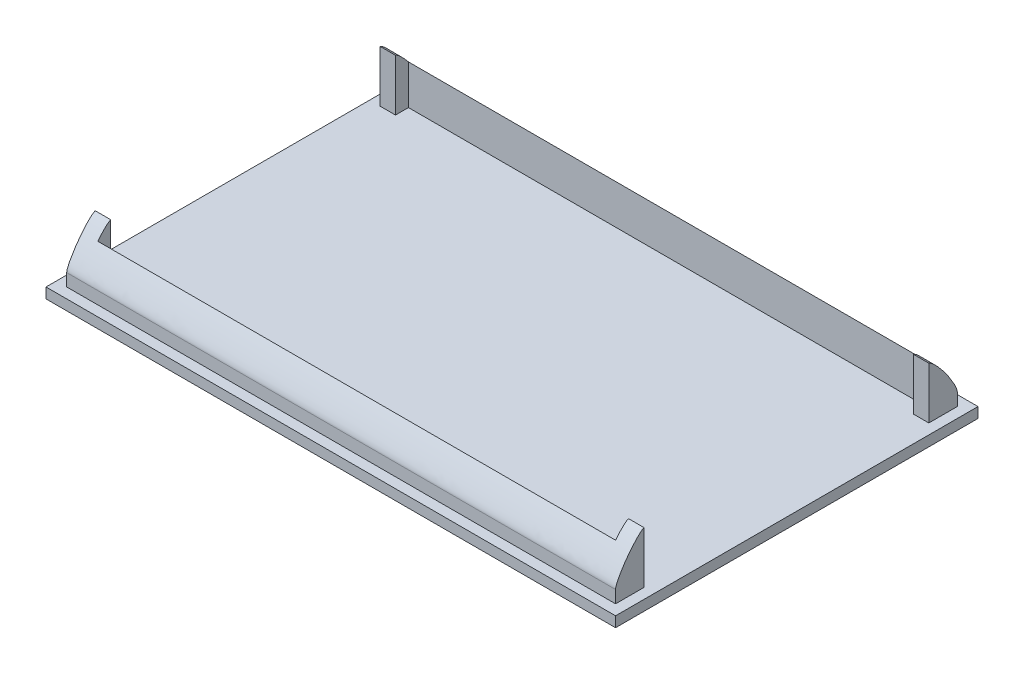
ISO-10303-21;
HEADER;
FILE_DESCRIPTION(('STEP AP214'),'2;1');
FILE_NAME('part.step','',(''),(''),'','','');
FILE_SCHEMA(('AUTOMOTIVE_DESIGN { 1 0 10303 214 1 1 1 1 }'));
ENDSEC;
DATA;
#1=APPLICATION_CONTEXT('core data for automotive mechanical design processes');
#2=APPLICATION_PROTOCOL_DEFINITION('international standard','automotive_design',2000,#1);
#3=PRODUCT_CONTEXT('',#1,'mechanical');
#4=PRODUCT('Part','Part','',(#3));
#5=PRODUCT_RELATED_PRODUCT_CATEGORY('part','',(#4));
#6=PRODUCT_DEFINITION_FORMATION('','',#4);
#7=PRODUCT_DEFINITION_CONTEXT('part definition',#1,'design');
#8=PRODUCT_DEFINITION('design','',#6,#7);
#9=PRODUCT_DEFINITION_SHAPE('','',#8);
#10=(LENGTH_UNIT() NAMED_UNIT(*) SI_UNIT(.MILLI.,.METRE.));
#11=(NAMED_UNIT(*) PLANE_ANGLE_UNIT() SI_UNIT($,.RADIAN.));
#12=(NAMED_UNIT(*) SI_UNIT($,.STERADIAN.) SOLID_ANGLE_UNIT());
#13=UNCERTAINTY_MEASURE_WITH_UNIT(LENGTH_MEASURE(1.E-05),#10,'distance_accuracy_value','');
#14=(GEOMETRIC_REPRESENTATION_CONTEXT(3) GLOBAL_UNCERTAINTY_ASSIGNED_CONTEXT((#13)) GLOBAL_UNIT_ASSIGNED_CONTEXT((#10,
#11,#12)) REPRESENTATION_CONTEXT('',''));
#15=CARTESIAN_POINT('',(0.,0.,0.));
#16=DIRECTION('',(0.,0.,1.));
#17=DIRECTION('',(1.,0.,0.));
#18=AXIS2_PLACEMENT_3D('',#15,#16,#17);
#19=CARTESIAN_POINT('',(53.,12.,-33.));
#20=DIRECTION('',(1.,0.,0.));
#21=DIRECTION('',(0.,0.,-1.));
#22=AXIS2_PLACEMENT_3D('',#19,#20,#21);
#23=PLANE('',#22);
#24=DIRECTION('',(0.,-1.,0.));
#25=VECTOR('',#24,1.);
#26=CARTESIAN_POINT('',(53.,12.,27.5));
#27=LINE('',#26,#25);
#28=CARTESIAN_POINT('',(53.,12.,27.5));
#29=VERTEX_POINT('',#28);
#30=CARTESIAN_POINT('',(53.,2.,27.5));
#31=VERTEX_POINT('',#30);
#32=EDGE_CURVE('E455',#29,#31,#27,.T.);
#33=ORIENTED_EDGE('',*,*,#32,.F.);
#34=CARTESIAN_POINT('',(53.,4.40065792321467,33.));
#35=CARTESIAN_POINT('',(53.,10.1906328388606,33.));
#36=CARTESIAN_POINT('',(53.,12.,27.5));
#37=(BOUNDED_CURVE() B_SPLINE_CURVE(2,(#34,#35,#36),.UNSPECIFIED.,.F.,
.F.) B_SPLINE_CURVE_WITH_KNOTS((3,3),(0.,1.),
.UNSPECIFIED.) CURVE() GEOMETRIC_REPRESENTATION_ITEM() RATIONAL_B_SPLINE_CURVE((1.,0.25,1.)) REPRESENTATION_ITEM(''));
#38=CARTESIAN_POINT('',(53.,4.40065792321467,33.));
#39=VERTEX_POINT('',#38);
#40=EDGE_CURVE('E92',#29,#39,#37,.F.);
#41=ORIENTED_EDGE('',*,*,#40,.T.);
#42=DIRECTION('',(0.,-1.,0.));
#43=VECTOR('',#42,1.);
#44=CARTESIAN_POINT('',(53.,12.,33.));
#45=LINE('',#44,#43);
#46=CARTESIAN_POINT('',(53.,2.,33.));
#47=VERTEX_POINT('',#46);
#48=EDGE_CURVE('E439',#39,#47,#45,.T.);
#49=ORIENTED_EDGE('',*,*,#48,.T.);
#50=DIRECTION('',(0.,0.,1.));
#51=VECTOR('',#50,1.);
#52=CARTESIAN_POINT('',(53.,2.,-33.));
#53=LINE('',#52,#51);
#54=EDGE_CURVE('E344',#31,#47,#53,.T.);
#55=ORIENTED_EDGE('',*,*,#54,.F.);
#56=EDGE_LOOP('',(#33,#41,#49,#55));
#57=FACE_BOUND('',#56,.T.);
#58=ADVANCED_FACE('F62',(#57),#23,.T.);
#59=CARTESIAN_POINT('',(-53.,12.,-33.));
#60=DIRECTION('',(1.,0.,0.));
#61=DIRECTION('',(0.,0.,-1.));
#62=AXIS2_PLACEMENT_3D('',#59,#60,#61);
#63=PLANE('',#62);
#64=DIRECTION('',(0.,-1.,0.));
#65=VECTOR('',#64,1.);
#66=CARTESIAN_POINT('',(-53.,12.,33.));
#67=LINE('',#66,#65);
#68=CARTESIAN_POINT('',(-53.,4.40065792321467,33.));
#69=VERTEX_POINT('',#68);
#70=CARTESIAN_POINT('',(-53.,2.,33.));
#71=VERTEX_POINT('',#70);
#72=EDGE_CURVE('E355',#69,#71,#67,.T.);
#73=ORIENTED_EDGE('',*,*,#72,.F.);
#74=CARTESIAN_POINT('',(-53.,12.,27.5));
#75=CARTESIAN_POINT('',(-53.,10.1906328388606,33.));
#76=CARTESIAN_POINT('',(-53.,4.40065792321467,33.));
#77=(BOUNDED_CURVE() B_SPLINE_CURVE(2,(#74,#75,#76),.UNSPECIFIED.,.F.,
.F.) B_SPLINE_CURVE_WITH_KNOTS((3,3),(0.,1.),
.UNSPECIFIED.) CURVE() GEOMETRIC_REPRESENTATION_ITEM() RATIONAL_B_SPLINE_CURVE((1.,0.25,1.)) REPRESENTATION_ITEM(''));
#78=CARTESIAN_POINT('',(-53.,12.,27.5));
#79=VERTEX_POINT('',#78);
#80=EDGE_CURVE('E13',#69,#79,#77,.F.);
#81=ORIENTED_EDGE('',*,*,#80,.T.);
#82=DIRECTION('',(0.,-1.,0.));
#83=VECTOR('',#82,1.);
#84=CARTESIAN_POINT('',(-53.,12.,27.5));
#85=LINE('',#84,#83);
#86=CARTESIAN_POINT('',(-53.,2.,27.5));
#87=VERTEX_POINT('',#86);
#88=EDGE_CURVE('E461',#79,#87,#85,.T.);
#89=ORIENTED_EDGE('',*,*,#88,.T.);
#90=DIRECTION('',(0.,0.,1.));
#91=VECTOR('',#90,1.);
#92=CARTESIAN_POINT('',(-53.,2.,-33.));
#93=LINE('',#92,#91);
#94=EDGE_CURVE('E351',#87,#71,#93,.T.);
#95=ORIENTED_EDGE('',*,*,#94,.T.);
#96=EDGE_LOOP('',(#73,#81,#89,#95));
#97=FACE_BOUND('',#96,.T.);
#98=ADVANCED_FACE('F407',(#97),#63,.F.);
#99=CARTESIAN_POINT('',(-50.,12.,30.));
#100=DIRECTION('',(-1.,0.,0.));
#101=DIRECTION('',(0.,0.,1.));
#102=AXIS2_PLACEMENT_3D('',#99,#100,#101);
#103=PLANE('',#102);
#104=DIRECTION('',(0.,1.,0.));
#105=VECTOR('',#104,1.);
#106=CARTESIAN_POINT('',(-50.,12.,27.5));
#107=LINE('',#106,#105);
#108=CARTESIAN_POINT('',(-50.,2.,27.5));
#109=VERTEX_POINT('',#108);
#110=CARTESIAN_POINT('',(-50.,12.,27.5));
#111=VERTEX_POINT('',#110);
#112=EDGE_CURVE('E467',#109,#111,#107,.T.);
#113=ORIENTED_EDGE('',*,*,#112,.T.);
#114=CARTESIAN_POINT('',(-50.,4.40065792321467,33.));
#115=CARTESIAN_POINT('',(-50.,10.1906328388606,33.));
#116=CARTESIAN_POINT('',(-50.,12.,27.5));
#117=(BOUNDED_CURVE() B_SPLINE_CURVE(2,(#114,#115,#116),.UNSPECIFIED.,.F.,
.F.) B_SPLINE_CURVE_WITH_KNOTS((3,3),(0.,1.),
.UNSPECIFIED.) CURVE() GEOMETRIC_REPRESENTATION_ITEM() RATIONAL_B_SPLINE_CURVE((1.,0.25,1.)) REPRESENTATION_ITEM(''));
#118=CARTESIAN_POINT('',(-50.,9.64556153314154,30.));
#119=VERTEX_POINT('',#118);
#120=EDGE_CURVE('E550',#111,#119,#117,.F.);
#121=ORIENTED_EDGE('',*,*,#120,.T.);
#122=DIRECTION('',(0.,-1.,0.));
#123=VECTOR('',#122,1.);
#124=CARTESIAN_POINT('',(-50.,12.,30.));
#125=LINE('',#124,#123);
#126=CARTESIAN_POINT('',(-50.,2.,30.));
#127=VERTEX_POINT('',#126);
#128=EDGE_CURVE('E328',#119,#127,#125,.T.);
#129=ORIENTED_EDGE('',*,*,#128,.T.);
#130=DIRECTION('',(0.,0.,-1.));
#131=VECTOR('',#130,1.);
#132=CARTESIAN_POINT('',(-50.,2.,30.));
#133=LINE('',#132,#131);
#134=EDGE_CURVE('E327',#127,#109,#133,.T.);
#135=ORIENTED_EDGE('',*,*,#134,.T.);
#136=EDGE_LOOP('',(#113,#121,#129,#135));
#137=FACE_BOUND('',#136,.T.);
#138=ADVANCED_FACE('F411',(#137),#103,.F.);
#139=CARTESIAN_POINT('',(50.,12.,30.));
#140=DIRECTION('',(-1.,0.,0.));
#141=DIRECTION('',(0.,0.,1.));
#142=AXIS2_PLACEMENT_3D('',#139,#140,#141);
#143=PLANE('',#142);
#144=DIRECTION('',(0.,-1.,0.));
#145=VECTOR('',#144,1.);
#146=CARTESIAN_POINT('',(50.,12.,30.));
#147=LINE('',#146,#145);
#148=CARTESIAN_POINT('',(50.,9.64556153314154,30.));
#149=VERTEX_POINT('',#148);
#150=CARTESIAN_POINT('',(50.,2.,30.));
#151=VERTEX_POINT('',#150);
#152=EDGE_CURVE('E326',#149,#151,#147,.T.);
#153=ORIENTED_EDGE('',*,*,#152,.F.);
#154=CARTESIAN_POINT('',(50.,12.,27.5));
#155=CARTESIAN_POINT('',(50.,10.1906328388606,33.));
#156=CARTESIAN_POINT('',(50.,4.40065792321467,33.));
#157=(BOUNDED_CURVE() B_SPLINE_CURVE(2,(#154,#155,#156),.UNSPECIFIED.,.F.,
.F.) B_SPLINE_CURVE_WITH_KNOTS((3,3),(0.,1.),
.UNSPECIFIED.) CURVE() GEOMETRIC_REPRESENTATION_ITEM() RATIONAL_B_SPLINE_CURVE((1.,0.25,1.)) REPRESENTATION_ITEM(''));
#158=CARTESIAN_POINT('',(50.,12.,27.5));
#159=VERTEX_POINT('',#158);
#160=EDGE_CURVE('E563',#149,#159,#157,.F.);
#161=ORIENTED_EDGE('',*,*,#160,.T.);
#162=DIRECTION('',(0.,1.,0.));
#163=VECTOR('',#162,1.);
#164=CARTESIAN_POINT('',(50.,12.,27.5));
#165=LINE('',#164,#163);
#166=CARTESIAN_POINT('',(50.,2.,27.5));
#167=VERTEX_POINT('',#166);
#168=EDGE_CURVE('E231',#167,#159,#165,.T.);
#169=ORIENTED_EDGE('',*,*,#168,.F.);
#170=DIRECTION('',(0.,0.,-1.));
#171=VECTOR('',#170,1.);
#172=CARTESIAN_POINT('',(50.,2.,30.));
#173=LINE('',#172,#171);
#174=EDGE_CURVE('E668',#151,#167,#173,.T.);
#175=ORIENTED_EDGE('',*,*,#174,.F.);
#176=EDGE_LOOP('',(#153,#161,#169,#175));
#177=FACE_BOUND('',#176,.T.);
#178=ADVANCED_FACE('F404',(#177),#143,.T.);
#179=CARTESIAN_POINT('',(55.,2.,35.));
#180=DIRECTION('',(-1.,0.,0.));
#181=DIRECTION('',(0.,0.,1.));
#182=AXIS2_PLACEMENT_3D('',#179,#180,#181);
#183=PLANE('',#182);
#184=DIRECTION('',(0.,0.,-1.));
#185=VECTOR('',#184,1.);
#186=CARTESIAN_POINT('',(55.,0.,35.));
#187=LINE('',#186,#185);
#188=CARTESIAN_POINT('',(55.,0.,35.));
#189=VERTEX_POINT('',#188);
#190=CARTESIAN_POINT('',(55.,0.,-35.));
#191=VERTEX_POINT('',#190);
#192=EDGE_CURVE('E449',#189,#191,#187,.T.);
#193=ORIENTED_EDGE('',*,*,#192,.T.);
#194=DIRECTION('',(0.,-1.,0.));
#195=VECTOR('',#194,1.);
#196=CARTESIAN_POINT('',(55.,2.,-35.));
#197=LINE('',#196,#195);
#198=CARTESIAN_POINT('',(55.,2.,-35.));
#199=VERTEX_POINT('',#198);
#200=EDGE_CURVE('E677',#199,#191,#197,.T.);
#201=ORIENTED_EDGE('',*,*,#200,.F.);
#202=DIRECTION('',(0.,0.,-1.));
#203=VECTOR('',#202,1.);
#204=CARTESIAN_POINT('',(55.,2.,35.));
#205=LINE('',#204,#203);
#206=CARTESIAN_POINT('',(55.,2.,35.));
#207=VERTEX_POINT('',#206);
#208=EDGE_CURVE('E445',#207,#199,#205,.T.);
#209=ORIENTED_EDGE('',*,*,#208,.F.);
#210=DIRECTION('',(0.,-1.,0.));
#211=VECTOR('',#210,1.);
#212=CARTESIAN_POINT('',(55.,2.,35.));
#213=LINE('',#212,#211);
#214=EDGE_CURVE('E689',#207,#189,#213,.T.);
#215=ORIENTED_EDGE('',*,*,#214,.T.);
#216=EDGE_LOOP('',(#193,#201,#209,#215));
#217=FACE_BOUND('',#216,.T.);
#218=ADVANCED_FACE('F262',(#217),#183,.F.);
#219=CARTESIAN_POINT('',(-55.,2.,-35.));
#220=DIRECTION('',(0.,0.,1.));
#221=DIRECTION('',(1.,0.,0.));
#222=AXIS2_PLACEMENT_3D('',#219,#220,#221);
#223=PLANE('',#222);
#224=DIRECTION('',(-1.,0.,0.));
#225=VECTOR('',#224,1.);
#226=CARTESIAN_POINT('',(-55.,0.,-35.));
#227=LINE('',#226,#225);
#228=CARTESIAN_POINT('',(-55.,0.,-35.));
#229=VERTEX_POINT('',#228);
#230=EDGE_CURVE('E697',#191,#229,#227,.T.);
#231=ORIENTED_EDGE('',*,*,#230,.T.);
#232=DIRECTION('',(0.,-1.,0.));
#233=VECTOR('',#232,1.);
#234=CARTESIAN_POINT('',(-55.,2.,-35.));
#235=LINE('',#234,#233);
#236=CARTESIAN_POINT('',(-55.,2.,-35.));
#237=VERTEX_POINT('',#236);
#238=EDGE_CURVE('E679',#237,#229,#235,.T.);
#239=ORIENTED_EDGE('',*,*,#238,.F.);
#240=DIRECTION('',(-1.,0.,0.));
#241=VECTOR('',#240,1.);
#242=CARTESIAN_POINT('',(-55.,2.,-35.));
#243=LINE('',#242,#241);
#244=EDGE_CURVE('E702',#199,#237,#243,.T.);
#245=ORIENTED_EDGE('',*,*,#244,.F.);
#246=ORIENTED_EDGE('',*,*,#200,.T.);
#247=EDGE_LOOP('',(#231,#239,#245,#246));
#248=FACE_BOUND('',#247,.T.);
#249=ADVANCED_FACE('F397',(#248),#223,.F.);
#250=CARTESIAN_POINT('',(-55.,2.,35.));
#251=DIRECTION('',(1.,0.,0.));
#252=DIRECTION('',(0.,0.,-1.));
#253=AXIS2_PLACEMENT_3D('',#250,#251,#252);
#254=PLANE('',#253);
#255=DIRECTION('',(0.,0.,1.));
#256=VECTOR('',#255,1.);
#257=CARTESIAN_POINT('',(-55.,0.,35.));
#258=LINE('',#257,#256);
#259=CARTESIAN_POINT('',(-55.,0.,35.));
#260=VERTEX_POINT('',#259);
#261=EDGE_CURVE('E695',#229,#260,#258,.T.);
#262=ORIENTED_EDGE('',*,*,#261,.T.);
#263=DIRECTION('',(0.,-1.,0.));
#264=VECTOR('',#263,1.);
#265=CARTESIAN_POINT('',(-55.,2.,35.));
#266=LINE('',#265,#264);
#267=CARTESIAN_POINT('',(-55.,2.,35.));
#268=VERTEX_POINT('',#267);
#269=EDGE_CURVE('E684',#268,#260,#266,.T.);
#270=ORIENTED_EDGE('',*,*,#269,.F.);
#271=DIRECTION('',(0.,0.,1.));
#272=VECTOR('',#271,1.);
#273=CARTESIAN_POINT('',(-55.,2.,35.));
#274=LINE('',#273,#272);
#275=EDGE_CURVE('E701',#237,#268,#274,.T.);
#276=ORIENTED_EDGE('',*,*,#275,.F.);
#277=ORIENTED_EDGE('',*,*,#238,.T.);
#278=EDGE_LOOP('',(#262,#270,#276,#277));
#279=FACE_BOUND('',#278,.T.);
#280=ADVANCED_FACE('F394',(#279),#254,.F.);
#281=CARTESIAN_POINT('',(-55.,2.,35.));
#282=DIRECTION('',(0.,0.,-1.));
#283=DIRECTION('',(-1.,0.,0.));
#284=AXIS2_PLACEMENT_3D('',#281,#282,#283);
#285=PLANE('',#284);
#286=DIRECTION('',(1.,0.,0.));
#287=VECTOR('',#286,1.);
#288=CARTESIAN_POINT('',(-55.,0.,35.));
#289=LINE('',#288,#287);
#290=EDGE_CURVE('E693',#260,#189,#289,.T.);
#291=ORIENTED_EDGE('',*,*,#290,.T.);
#292=ORIENTED_EDGE('',*,*,#214,.F.);
#293=DIRECTION('',(1.,0.,0.));
#294=VECTOR('',#293,1.);
#295=CARTESIAN_POINT('',(-55.,2.,35.));
#296=LINE('',#295,#294);
#297=EDGE_CURVE('E692',#268,#207,#296,.T.);
#298=ORIENTED_EDGE('',*,*,#297,.F.);
#299=ORIENTED_EDGE('',*,*,#269,.T.);
#300=EDGE_LOOP('',(#291,#292,#298,#299));
#301=FACE_BOUND('',#300,.T.);
#302=ADVANCED_FACE('F390',(#301),#285,.F.);
#303=CARTESIAN_POINT('',(0.,0.,0.));
#304=DIRECTION('',(0.,-1.,0.));
#305=DIRECTION('',(0.,0.,-1.));
#306=AXIS2_PLACEMENT_3D('',#303,#304,#305);
#307=PLANE('',#306);
#308=ORIENTED_EDGE('',*,*,#192,.F.);
#309=ORIENTED_EDGE('',*,*,#290,.F.);
#310=ORIENTED_EDGE('',*,*,#261,.F.);
#311=ORIENTED_EDGE('',*,*,#230,.F.);
#312=EDGE_LOOP('',(#308,#309,#310,#311));
#313=FACE_BOUND('',#312,.T.);
#314=ADVANCED_FACE('F381',(#313),#307,.T.);
#315=CARTESIAN_POINT('',(-53.,12.,33.));
#316=DIRECTION('',(0.,0.,-1.));
#317=DIRECTION('',(-1.,0.,0.));
#318=AXIS2_PLACEMENT_3D('',#315,#316,#317);
#319=PLANE('',#318);
#320=ORIENTED_EDGE('',*,*,#48,.F.);
#321=CARTESIAN_POINT('',(-58.3,4.40065792321467,33.));
#322=CARTESIAN_POINT('',(-19.4333333333333,4.40065792321467,33.));
#323=CARTESIAN_POINT('',(19.4333333333334,4.40065792321467,33.));
#324=CARTESIAN_POINT('',(58.3,4.40065792321467,33.));
#325=(BOUNDED_CURVE() B_SPLINE_CURVE(3,(#321,#322,#323,#324),.UNSPECIFIED.,.F.,
.F.) B_SPLINE_CURVE_WITH_KNOTS((4,4),(-0.0583,0.0583),
.UNSPECIFIED.) CURVE() GEOMETRIC_REPRESENTATION_ITEM() RATIONAL_B_SPLINE_CURVE((1.,1.,1.,1.)) REPRESENTATION_ITEM(''));
#326=EDGE_CURVE('E77',#39,#69,#325,.F.);
#327=ORIENTED_EDGE('',*,*,#326,.T.);
#328=ORIENTED_EDGE('',*,*,#72,.T.);
#329=DIRECTION('',(1.,0.,0.));
#330=VECTOR('',#329,1.);
#331=CARTESIAN_POINT('',(-53.,2.,33.));
#332=LINE('',#331,#330);
#333=EDGE_CURVE('E341',#71,#47,#332,.T.);
#334=ORIENTED_EDGE('',*,*,#333,.T.);
#335=EDGE_LOOP('',(#320,#327,#328,#334));
#336=FACE_BOUND('',#335,.T.);
#337=ADVANCED_FACE('F371',(#336),#319,.F.);
#338=DIRECTION('',(0.,-1.,0.));
#339=VECTOR('',#338,1.);
#340=CARTESIAN_POINT('',(53.,12.,-33.));
#341=LINE('',#340,#339);
#342=CARTESIAN_POINT('',(53.,4.40065792321467,-33.));
#343=VERTEX_POINT('',#342);
#344=CARTESIAN_POINT('',(53.,2.,-33.));
#345=VERTEX_POINT('',#344);
#346=EDGE_CURVE('E214',#343,#345,#341,.T.);
#347=ORIENTED_EDGE('',*,*,#346,.F.);
#348=CARTESIAN_POINT('',(53.,12.,-27.5));
#349=CARTESIAN_POINT('',(53.,10.1906328388606,-33.));
#350=CARTESIAN_POINT('',(53.,4.40065792321467,-33.));
#351=(BOUNDED_CURVE() B_SPLINE_CURVE(2,(#348,#349,#350),.UNSPECIFIED.,.F.,
.F.) B_SPLINE_CURVE_WITH_KNOTS((3,3),(0.,1.),
.UNSPECIFIED.) CURVE() GEOMETRIC_REPRESENTATION_ITEM() RATIONAL_B_SPLINE_CURVE((1.,0.25,1.)) REPRESENTATION_ITEM(''));
#352=CARTESIAN_POINT('',(53.,12.,-27.5));
#353=VERTEX_POINT('',#352);
#354=EDGE_CURVE('E207',#343,#353,#351,.F.);
#355=ORIENTED_EDGE('',*,*,#354,.T.);
#356=DIRECTION('',(0.,1.,0.));
#357=VECTOR('',#356,1.);
#358=CARTESIAN_POINT('',(53.,12.,-27.5));
#359=LINE('',#358,#357);
#360=CARTESIAN_POINT('',(53.,2.,-27.5));
#361=VERTEX_POINT('',#360);
#362=EDGE_CURVE('E212',#361,#353,#359,.T.);
#363=ORIENTED_EDGE('',*,*,#362,.F.);
#364=EDGE_CURVE('E346',#345,#361,#53,.T.);
#365=ORIENTED_EDGE('',*,*,#364,.F.);
#366=EDGE_LOOP('',(#347,#355,#363,#365));
#367=FACE_BOUND('',#366,.T.);
#368=ADVANCED_FACE('F210',(#367),#23,.T.);
#369=CARTESIAN_POINT('',(-53.,12.,-33.));
#370=DIRECTION('',(0.,0.,-1.));
#371=DIRECTION('',(-1.,0.,0.));
#372=AXIS2_PLACEMENT_3D('',#369,#370,#371);
#373=PLANE('',#372);
#374=DIRECTION('',(0.,-1.,0.));
#375=VECTOR('',#374,1.);
#376=CARTESIAN_POINT('',(-53.,12.,-33.));
#377=LINE('',#376,#375);
#378=CARTESIAN_POINT('',(-53.,4.40065792321467,-33.));
#379=VERTEX_POINT('',#378);
#380=CARTESIAN_POINT('',(-53.,2.,-33.));
#381=VERTEX_POINT('',#380);
#382=EDGE_CURVE('E362',#379,#381,#377,.T.);
#383=ORIENTED_EDGE('',*,*,#382,.F.);
#384=CARTESIAN_POINT('',(58.3,4.40065792321467,-33.));
#385=CARTESIAN_POINT('',(19.4333333333334,4.40065792321467,-33.));
#386=CARTESIAN_POINT('',(-19.4333333333333,4.40065792321467,-33.));
#387=CARTESIAN_POINT('',(-58.3,4.40065792321467,-33.));
#388=(BOUNDED_CURVE() B_SPLINE_CURVE(3,(#384,#385,#386,#387),.UNSPECIFIED.,.F.,
.F.) B_SPLINE_CURVE_WITH_KNOTS((4,4),(-0.0583,0.0583),
.UNSPECIFIED.) CURVE() GEOMETRIC_REPRESENTATION_ITEM() RATIONAL_B_SPLINE_CURVE((1.,1.,1.,1.)) REPRESENTATION_ITEM(''));
#389=EDGE_CURVE('E221',#379,#343,#388,.F.);
#390=ORIENTED_EDGE('',*,*,#389,.T.);
#391=ORIENTED_EDGE('',*,*,#346,.T.);
#392=DIRECTION('',(1.,0.,0.));
#393=VECTOR('',#392,1.);
#394=CARTESIAN_POINT('',(-53.,2.,-33.));
#395=LINE('',#394,#393);
#396=EDGE_CURVE('E348',#381,#345,#395,.T.);
#397=ORIENTED_EDGE('',*,*,#396,.F.);
#398=EDGE_LOOP('',(#383,#390,#391,#397));
#399=FACE_BOUND('',#398,.T.);
#400=ADVANCED_FACE('F416',(#399),#373,.T.);
#401=DIRECTION('',(0.,1.,0.));
#402=VECTOR('',#401,1.);
#403=CARTESIAN_POINT('',(-53.,12.,-27.5));
#404=LINE('',#403,#402);
#405=CARTESIAN_POINT('',(-53.,2.,-27.5));
#406=VERTEX_POINT('',#405);
#407=CARTESIAN_POINT('',(-53.,12.,-27.5));
#408=VERTEX_POINT('',#407);
#409=EDGE_CURVE('E232',#406,#408,#404,.T.);
#410=ORIENTED_EDGE('',*,*,#409,.T.);
#411=CARTESIAN_POINT('',(-53.,4.40065792321467,-33.));
#412=CARTESIAN_POINT('',(-53.,10.1906328388606,-33.));
#413=CARTESIAN_POINT('',(-53.,12.,-27.5));
#414=(BOUNDED_CURVE() B_SPLINE_CURVE(2,(#411,#412,#413),.UNSPECIFIED.,.F.,
.F.) B_SPLINE_CURVE_WITH_KNOTS((3,3),(0.,1.),
.UNSPECIFIED.) CURVE() GEOMETRIC_REPRESENTATION_ITEM() RATIONAL_B_SPLINE_CURVE((1.,0.25,1.)) REPRESENTATION_ITEM(''));
#415=EDGE_CURVE('E312',#408,#379,#414,.F.);
#416=ORIENTED_EDGE('',*,*,#415,.T.);
#417=ORIENTED_EDGE('',*,*,#382,.T.);
#418=EDGE_CURVE('E352',#381,#406,#93,.T.);
#419=ORIENTED_EDGE('',*,*,#418,.T.);
#420=EDGE_LOOP('',(#410,#416,#417,#419));
#421=FACE_BOUND('',#420,.T.);
#422=ADVANCED_FACE('F414',(#421),#63,.F.);
#423=CARTESIAN_POINT('',(-50.,12.,-30.));
#424=DIRECTION('',(0.,0.,-1.));
#425=DIRECTION('',(-1.,0.,0.));
#426=AXIS2_PLACEMENT_3D('',#423,#424,#425);
#427=PLANE('',#426);
#428=DIRECTION('',(0.,-1.,0.));
#429=VECTOR('',#428,1.);
#430=CARTESIAN_POINT('',(50.,12.,-30.));
#431=LINE('',#430,#429);
#432=CARTESIAN_POINT('',(50.,9.64556153314155,-30.));
#433=VERTEX_POINT('',#432);
#434=CARTESIAN_POINT('',(50.,2.,-30.));
#435=VERTEX_POINT('',#434);
#436=EDGE_CURVE('E317',#433,#435,#431,.T.);
#437=ORIENTED_EDGE('',*,*,#436,.F.);
#438=CARTESIAN_POINT('',(-58.3,9.64556153314155,-30.));
#439=CARTESIAN_POINT('',(-19.4333333333333,9.64556153314155,-30.));
#440=CARTESIAN_POINT('',(19.4333333333333,9.64556153314155,-30.));
#441=CARTESIAN_POINT('',(58.3,9.64556153314155,-30.));
#442=(BOUNDED_CURVE() B_SPLINE_CURVE(3,(#438,#439,#440,#441),.UNSPECIFIED.,.F.,
.F.) B_SPLINE_CURVE_WITH_KNOTS((4,4),(-0.0583,0.0583),
.UNSPECIFIED.) CURVE() GEOMETRIC_REPRESENTATION_ITEM() RATIONAL_B_SPLINE_CURVE((0.637003073573872,
0.637003073573872,0.637003073573872,0.637003073573872)) REPRESENTATION_ITEM(''));
#443=CARTESIAN_POINT('',(-50.,9.64556153314153,-30.));
#444=VERTEX_POINT('',#443);
#445=EDGE_CURVE('E305',#433,#444,#442,.F.);
#446=ORIENTED_EDGE('',*,*,#445,.T.);
#447=DIRECTION('',(0.,-1.,0.));
#448=VECTOR('',#447,1.);
#449=CARTESIAN_POINT('',(-50.,12.,-30.));
#450=LINE('',#449,#448);
#451=CARTESIAN_POINT('',(-50.,2.,-30.));
#452=VERTEX_POINT('',#451);
#453=EDGE_CURVE('E345',#444,#452,#450,.T.);
#454=ORIENTED_EDGE('',*,*,#453,.T.);
#455=DIRECTION('',(1.,0.,0.));
#456=VECTOR('',#455,1.);
#457=CARTESIAN_POINT('',(-50.,2.,-30.));
#458=LINE('',#457,#456);
#459=EDGE_CURVE('E325',#452,#435,#458,.T.);
#460=ORIENTED_EDGE('',*,*,#459,.T.);
#461=EDGE_LOOP('',(#437,#446,#454,#460));
#462=FACE_BOUND('',#461,.T.);
#463=ADVANCED_FACE('F323',(#462),#427,.F.);
#464=ORIENTED_EDGE('',*,*,#453,.F.);
#465=CARTESIAN_POINT('',(-50.,12.,-27.5));
#466=CARTESIAN_POINT('',(-50.,10.1906328388606,-33.));
#467=CARTESIAN_POINT('',(-50.,4.40065792321467,-33.));
#468=(BOUNDED_CURVE() B_SPLINE_CURVE(2,(#465,#466,#467),.UNSPECIFIED.,.F.,
.F.) B_SPLINE_CURVE_WITH_KNOTS((3,3),(0.,1.),
.UNSPECIFIED.) CURVE() GEOMETRIC_REPRESENTATION_ITEM() RATIONAL_B_SPLINE_CURVE((1.,0.25,1.)) REPRESENTATION_ITEM(''));
#469=CARTESIAN_POINT('',(-50.,12.,-27.5));
#470=VERTEX_POINT('',#469);
#471=EDGE_CURVE('E307',#444,#470,#468,.F.);
#472=ORIENTED_EDGE('',*,*,#471,.T.);
#473=DIRECTION('',(0.,-1.,0.));
#474=VECTOR('',#473,1.);
#475=CARTESIAN_POINT('',(-50.,12.,-27.5));
#476=LINE('',#475,#474);
#477=CARTESIAN_POINT('',(-50.,2.,-27.5));
#478=VERTEX_POINT('',#477);
#479=EDGE_CURVE('E537',#470,#478,#476,.T.);
#480=ORIENTED_EDGE('',*,*,#479,.T.);
#481=EDGE_CURVE('E331',#478,#452,#133,.T.);
#482=ORIENTED_EDGE('',*,*,#481,.T.);
#483=EDGE_LOOP('',(#464,#472,#480,#482));
#484=FACE_BOUND('',#483,.T.);
#485=ADVANCED_FACE('F514',(#484),#103,.F.);
#486=CARTESIAN_POINT('',(-50.,12.,30.));
#487=DIRECTION('',(0.,0.,-1.));
#488=DIRECTION('',(-1.,0.,0.));
#489=AXIS2_PLACEMENT_3D('',#486,#487,#488);
#490=PLANE('',#489);
#491=ORIENTED_EDGE('',*,*,#128,.F.);
#492=CARTESIAN_POINT('',(58.3,9.64556153314154,30.));
#493=CARTESIAN_POINT('',(19.4333333333334,9.64556153314154,30.));
#494=CARTESIAN_POINT('',(-19.4333333333333,9.64556153314154,30.));
#495=CARTESIAN_POINT('',(-58.3,9.64556153314154,30.));
#496=(BOUNDED_CURVE() B_SPLINE_CURVE(3,(#492,#493,#494,#495),.UNSPECIFIED.,.F.,
.F.) B_SPLINE_CURVE_WITH_KNOTS((4,4),(-0.0583,0.0583),
.UNSPECIFIED.) CURVE() GEOMETRIC_REPRESENTATION_ITEM() RATIONAL_B_SPLINE_CURVE((0.637003073573871,
0.637003073573871,0.637003073573871,0.637003073573871)) REPRESENTATION_ITEM(''));
#497=EDGE_CURVE('E498',#119,#149,#496,.F.);
#498=ORIENTED_EDGE('',*,*,#497,.T.);
#499=ORIENTED_EDGE('',*,*,#152,.T.);
#500=DIRECTION('',(1.,0.,0.));
#501=VECTOR('',#500,1.);
#502=CARTESIAN_POINT('',(-50.,2.,30.));
#503=LINE('',#502,#501);
#504=EDGE_CURVE('E557',#127,#151,#503,.T.);
#505=ORIENTED_EDGE('',*,*,#504,.F.);
#506=EDGE_LOOP('',(#491,#498,#499,#505));
#507=FACE_BOUND('',#506,.T.);
#508=ADVANCED_FACE('F505',(#507),#490,.T.);
#509=DIRECTION('',(0.,-1.,0.));
#510=VECTOR('',#509,1.);
#511=CARTESIAN_POINT('',(50.,12.,-27.5));
#512=LINE('',#511,#510);
#513=CARTESIAN_POINT('',(50.,12.,-27.5));
#514=VERTEX_POINT('',#513);
#515=CARTESIAN_POINT('',(50.,2.,-27.5));
#516=VERTEX_POINT('',#515);
#517=EDGE_CURVE('E319',#514,#516,#512,.T.);
#518=ORIENTED_EDGE('',*,*,#517,.F.);
#519=CARTESIAN_POINT('',(50.,4.40065792321467,-33.));
#520=CARTESIAN_POINT('',(50.,10.1906328388606,-33.));
#521=CARTESIAN_POINT('',(50.,12.,-27.5));
#522=(BOUNDED_CURVE() B_SPLINE_CURVE(2,(#519,#520,#521),.UNSPECIFIED.,.F.,
.F.) B_SPLINE_CURVE_WITH_KNOTS((3,3),(0.,1.),
.UNSPECIFIED.) CURVE() GEOMETRIC_REPRESENTATION_ITEM() RATIONAL_B_SPLINE_CURVE((1.,0.25,1.)) REPRESENTATION_ITEM(''));
#523=EDGE_CURVE('E220',#514,#433,#522,.F.);
#524=ORIENTED_EDGE('',*,*,#523,.T.);
#525=ORIENTED_EDGE('',*,*,#436,.T.);
#526=EDGE_CURVE('E464',#516,#435,#173,.T.);
#527=ORIENTED_EDGE('',*,*,#526,.F.);
#528=EDGE_LOOP('',(#518,#524,#525,#527));
#529=FACE_BOUND('',#528,.T.);
#530=ADVANCED_FACE('F315',(#529),#143,.T.);
#531=CARTESIAN_POINT('',(0.,2.,0.));
#532=DIRECTION('',(0.,-1.,0.));
#533=DIRECTION('',(0.,0.,-1.));
#534=AXIS2_PLACEMENT_3D('',#531,#532,#533);
#535=PLANE('',#534);
#536=DIRECTION('',(1.,0.,0.));
#537=VECTOR('',#536,1.);
#538=CARTESIAN_POINT('',(-55.,2.,27.5));
#539=LINE('',#538,#537);
#540=EDGE_CURVE('E665',#167,#31,#539,.T.);
#541=ORIENTED_EDGE('',*,*,#540,.T.);
#542=ORIENTED_EDGE('',*,*,#54,.T.);
#543=ORIENTED_EDGE('',*,*,#333,.F.);
#544=ORIENTED_EDGE('',*,*,#94,.F.);
#545=EDGE_CURVE('E538',#87,#109,#539,.T.);
#546=ORIENTED_EDGE('',*,*,#545,.T.);
#547=ORIENTED_EDGE('',*,*,#134,.F.);
#548=ORIENTED_EDGE('',*,*,#504,.T.);
#549=ORIENTED_EDGE('',*,*,#174,.T.);
#550=EDGE_LOOP('',(#541,#542,#543,#544,#546,#547,#548,#549));
#551=FACE_BOUND('',#550,.T.);
#552=DIRECTION('',(-1.,0.,0.));
#553=VECTOR('',#552,1.);
#554=CARTESIAN_POINT('',(-55.,2.,-27.5));
#555=LINE('',#554,#553);
#556=EDGE_CURVE('E658',#478,#406,#555,.T.);
#557=ORIENTED_EDGE('',*,*,#556,.T.);
#558=ORIENTED_EDGE('',*,*,#418,.F.);
#559=ORIENTED_EDGE('',*,*,#396,.T.);
#560=ORIENTED_EDGE('',*,*,#364,.T.);
#561=EDGE_CURVE('E230',#361,#516,#555,.T.);
#562=ORIENTED_EDGE('',*,*,#561,.T.);
#563=ORIENTED_EDGE('',*,*,#526,.T.);
#564=ORIENTED_EDGE('',*,*,#459,.F.);
#565=ORIENTED_EDGE('',*,*,#481,.F.);
#566=EDGE_LOOP('',(#557,#558,#559,#560,#562,#563,#564,#565));
#567=FACE_BOUND('',#566,.T.);
#568=ORIENTED_EDGE('',*,*,#275,.T.);
#569=ORIENTED_EDGE('',*,*,#297,.T.);
#570=ORIENTED_EDGE('',*,*,#208,.T.);
#571=ORIENTED_EDGE('',*,*,#244,.T.);
#572=EDGE_LOOP('',(#568,#569,#570,#571));
#573=FACE_BOUND('',#572,.T.);
#574=ADVANCED_FACE('F384',(#551,#567,#573),#535,.F.);
#575=CARTESIAN_POINT('',(-55.,2.,-27.5));
#576=DIRECTION('',(0.,0.,-1.));
#577=DIRECTION('',(-1.,0.,0.));
#578=AXIS2_PLACEMENT_3D('',#575,#576,#577);
#579=PLANE('',#578);
#580=ORIENTED_EDGE('',*,*,#362,.T.);
#581=CARTESIAN_POINT('',(-58.3,12.,-27.5));
#582=CARTESIAN_POINT('',(-19.4333333333333,12.,-27.5));
#583=CARTESIAN_POINT('',(19.4333333333333,12.,-27.5));
#584=CARTESIAN_POINT('',(58.3,12.,-27.5));
#585=(BOUNDED_CURVE() B_SPLINE_CURVE(3,(#581,#582,#583,#584),.UNSPECIFIED.,.F.,
.F.) B_SPLINE_CURVE_WITH_KNOTS((4,4),(-0.0583,0.0583),
.UNSPECIFIED.) CURVE() GEOMETRIC_REPRESENTATION_ITEM() RATIONAL_B_SPLINE_CURVE((1.,1.,1.,1.)) REPRESENTATION_ITEM(''));
#586=EDGE_CURVE('E227',#353,#514,#585,.F.);
#587=ORIENTED_EDGE('',*,*,#586,.T.);
#588=ORIENTED_EDGE('',*,*,#517,.T.);
#589=ORIENTED_EDGE('',*,*,#561,.F.);
#590=EDGE_LOOP('',(#580,#587,#588,#589));
#591=FACE_BOUND('',#590,.T.);
#592=ADVANCED_FACE('F225',(#591),#579,.F.);
#593=CARTESIAN_POINT('',(-55.,2.,27.5));
#594=DIRECTION('',(0.,0.,1.));
#595=DIRECTION('',(1.,0.,0.));
#596=AXIS2_PLACEMENT_3D('',#593,#594,#595);
#597=PLANE('',#596);
#598=ORIENTED_EDGE('',*,*,#32,.T.);
#599=ORIENTED_EDGE('',*,*,#540,.F.);
#600=ORIENTED_EDGE('',*,*,#168,.T.);
#601=CARTESIAN_POINT('',(58.3,12.,27.5));
#602=CARTESIAN_POINT('',(19.4333333333334,12.,27.5));
#603=CARTESIAN_POINT('',(-19.4333333333333,12.,27.5));
#604=CARTESIAN_POINT('',(-58.3,12.,27.5));
#605=(BOUNDED_CURVE() B_SPLINE_CURVE(3,(#601,#602,#603,#604),.UNSPECIFIED.,.F.,
.F.) B_SPLINE_CURVE_WITH_KNOTS((4,4),(-0.0583,0.0583),
.UNSPECIFIED.) CURVE() GEOMETRIC_REPRESENTATION_ITEM() RATIONAL_B_SPLINE_CURVE((1.,1.,1.,1.)) REPRESENTATION_ITEM(''));
#606=EDGE_CURVE('E239',#159,#29,#605,.F.);
#607=ORIENTED_EDGE('',*,*,#606,.T.);
#608=EDGE_LOOP('',(#598,#599,#600,#607));
#609=FACE_BOUND('',#608,.T.);
#610=ADVANCED_FACE('F616',(#609),#597,.F.);
#611=CARTESIAN_POINT('',(58.3,12.,27.5));
#612=CARTESIAN_POINT('',(19.4333333333334,12.,27.5));
#613=CARTESIAN_POINT('',(-19.4333333333333,12.,27.5));
#614=CARTESIAN_POINT('',(-58.3,12.,27.5));
#615=(BOUNDED_CURVE() B_SPLINE_CURVE(3,(#611,#612,#613,#614),.UNSPECIFIED.,.F.,
.F.) B_SPLINE_CURVE_WITH_KNOTS((4,4),(-0.0583,0.0583),
.UNSPECIFIED.) CURVE() GEOMETRIC_REPRESENTATION_ITEM() RATIONAL_B_SPLINE_CURVE((1.,1.,1.,1.)) REPRESENTATION_ITEM(''));
#616=EDGE_CURVE('E586',#79,#111,#615,.F.);
#617=ORIENTED_EDGE('',*,*,#616,.T.);
#618=ORIENTED_EDGE('',*,*,#112,.F.);
#619=ORIENTED_EDGE('',*,*,#545,.F.);
#620=ORIENTED_EDGE('',*,*,#88,.F.);
#621=EDGE_LOOP('',(#617,#618,#619,#620));
#622=FACE_BOUND('',#621,.T.);
#623=ADVANCED_FACE('F624',(#622),#597,.F.);
#624=ORIENTED_EDGE('',*,*,#556,.F.);
#625=ORIENTED_EDGE('',*,*,#479,.F.);
#626=CARTESIAN_POINT('',(-58.3,12.,-27.5));
#627=CARTESIAN_POINT('',(-19.4333333333333,12.,-27.5));
#628=CARTESIAN_POINT('',(19.4333333333333,12.,-27.5));
#629=CARTESIAN_POINT('',(58.3,12.,-27.5));
#630=(BOUNDED_CURVE() B_SPLINE_CURVE(3,(#626,#627,#628,#629),.UNSPECIFIED.,.F.,
.F.) B_SPLINE_CURVE_WITH_KNOTS((4,4),(-0.0583,0.0583),
.UNSPECIFIED.) CURVE() GEOMETRIC_REPRESENTATION_ITEM() RATIONAL_B_SPLINE_CURVE((1.,1.,1.,1.)) REPRESENTATION_ITEM(''));
#631=EDGE_CURVE('E240',#470,#408,#630,.F.);
#632=ORIENTED_EDGE('',*,*,#631,.T.);
#633=ORIENTED_EDGE('',*,*,#409,.F.);
#634=EDGE_LOOP('',(#624,#625,#632,#633));
#635=FACE_BOUND('',#634,.T.);
#636=ADVANCED_FACE('F261',(#635),#579,.F.);
#637=CARTESIAN_POINT('',(-58.3,4.40065792321467,-33.));
#638=CARTESIAN_POINT('',(-19.4333333333333,4.40065792321467,-33.));
#639=CARTESIAN_POINT('',(19.4333333333334,4.40065792321467,-33.));
#640=CARTESIAN_POINT('',(58.3,4.40065792321467,-33.));
#641=CARTESIAN_POINT('',(-58.3,10.1906328388606,-33.));
#642=CARTESIAN_POINT('',(-19.4333333333333,10.1906328388606,-33.));
#643=CARTESIAN_POINT('',(19.4333333333333,10.1906328388606,-33.));
#644=CARTESIAN_POINT('',(58.3,10.1906328388606,-33.));
#645=CARTESIAN_POINT('',(-58.3,12.,-27.5));
#646=CARTESIAN_POINT('',(-19.4333333333333,12.,-27.5));
#647=CARTESIAN_POINT('',(19.4333333333333,12.,-27.5));
#648=CARTESIAN_POINT('',(58.3,12.,-27.5));
#649=(BOUNDED_SURFACE() B_SPLINE_SURFACE(2,3,((#637,#638,#639,#640),(#641,#642,#643,#644),(#645,
#646,#647,#648)),.UNSPECIFIED.,.F.,.F.,.F.) B_SPLINE_SURFACE_WITH_KNOTS((3,3),(4,4),(0.,1.),
(-0.0583,0.0583),.UNSPECIFIED.) GEOMETRIC_REPRESENTATION_ITEM() RATIONAL_B_SPLINE_SURFACE(((1.,
1.,1.,1.),(0.25,0.25,0.25,0.25),(1.,1.,1.,1.))) REPRESENTATION_ITEM('') SURFACE());
#650=ORIENTED_EDGE('',*,*,#523,.F.);
#651=ORIENTED_EDGE('',*,*,#586,.F.);
#652=ORIENTED_EDGE('',*,*,#354,.F.);
#653=ORIENTED_EDGE('',*,*,#389,.F.);
#654=ORIENTED_EDGE('',*,*,#415,.F.);
#655=ORIENTED_EDGE('',*,*,#631,.F.);
#656=ORIENTED_EDGE('',*,*,#471,.F.);
#657=ORIENTED_EDGE('',*,*,#445,.F.);
#658=EDGE_LOOP('',(#650,#651,#652,#653,#654,#655,#656,#657));
#659=FACE_BOUND('',#658,.T.);
#660=ADVANCED_FACE('F236',(#659),#649,.T.);
#661=CARTESIAN_POINT('',(58.3,4.40065792321467,33.));
#662=CARTESIAN_POINT('',(19.4333333333334,4.40065792321467,33.));
#663=CARTESIAN_POINT('',(-19.4333333333333,4.40065792321467,33.));
#664=CARTESIAN_POINT('',(-58.3,4.40065792321467,33.));
#665=CARTESIAN_POINT('',(58.3,10.1906328388606,33.));
#666=CARTESIAN_POINT('',(19.4333333333334,10.1906328388606,33.));
#667=CARTESIAN_POINT('',(-19.4333333333333,10.1906328388606,33.));
#668=CARTESIAN_POINT('',(-58.3,10.1906328388606,33.));
#669=CARTESIAN_POINT('',(58.3,12.,27.5));
#670=CARTESIAN_POINT('',(19.4333333333334,12.,27.5));
#671=CARTESIAN_POINT('',(-19.4333333333333,12.,27.5));
#672=CARTESIAN_POINT('',(-58.3,12.,27.5));
#673=(BOUNDED_SURFACE() B_SPLINE_SURFACE(2,3,((#661,#662,#663,#664),(#665,#666,#667,#668),(#669,
#670,#671,#672)),.UNSPECIFIED.,.F.,.F.,.F.) B_SPLINE_SURFACE_WITH_KNOTS((3,3),(4,4),(0.,1.),
(-0.0583,0.0583),.UNSPECIFIED.) GEOMETRIC_REPRESENTATION_ITEM() RATIONAL_B_SPLINE_SURFACE(((1.,
1.,1.,1.),(0.25,0.25,0.25,0.25),(1.,1.,1.,1.))) REPRESENTATION_ITEM('') SURFACE());
#674=ORIENTED_EDGE('',*,*,#80,.F.);
#675=ORIENTED_EDGE('',*,*,#326,.F.);
#676=ORIENTED_EDGE('',*,*,#40,.F.);
#677=ORIENTED_EDGE('',*,*,#606,.F.);
#678=ORIENTED_EDGE('',*,*,#160,.F.);
#679=ORIENTED_EDGE('',*,*,#497,.F.);
#680=ORIENTED_EDGE('',*,*,#120,.F.);
#681=ORIENTED_EDGE('',*,*,#616,.F.);
#682=EDGE_LOOP('',(#674,#675,#676,#677,#678,#679,#680,#681));
#683=FACE_BOUND('',#682,.T.);
#684=ADVANCED_FACE('F65',(#683),#673,.T.);
#685=CLOSED_SHELL('',(#58,#98,#138,#178,#218,#249,#280,#302,#314,#337,#368,#400,#422,#463,#485,
#508,#530,#574,#592,#610,#623,#636,#660,#684));
#686=MANIFOLD_SOLID_BREP('B2',#685);
#687=ADVANCED_BREP_SHAPE_REPRESENTATION('',(#18,#686),#14);
#688=SHAPE_DEFINITION_REPRESENTATION(#9,#687);
ENDSEC;
END-ISO-10303-21;
